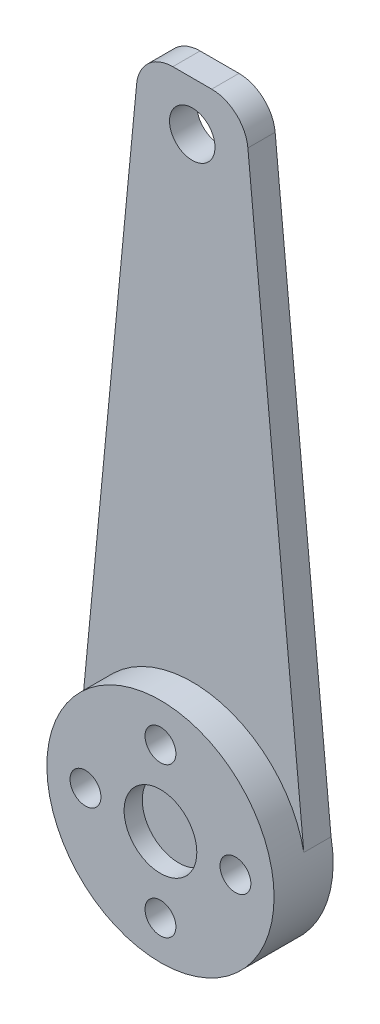
ISO-10303-21;
HEADER;
FILE_DESCRIPTION(('STEP AP214'),'2;1');
FILE_NAME('part.step','',(''),(''),'','','');
FILE_SCHEMA(('AUTOMOTIVE_DESIGN { 1 0 10303 214 1 1 1 1 }'));
ENDSEC;
DATA;
#1=APPLICATION_CONTEXT('core data for automotive mechanical design processes');
#2=APPLICATION_PROTOCOL_DEFINITION('international standard','automotive_design',2000,#1);
#3=PRODUCT_CONTEXT('',#1,'mechanical');
#4=PRODUCT('Part','Part','',(#3));
#5=PRODUCT_RELATED_PRODUCT_CATEGORY('part','',(#4));
#6=PRODUCT_DEFINITION_FORMATION('','',#4);
#7=PRODUCT_DEFINITION_CONTEXT('part definition',#1,'design');
#8=PRODUCT_DEFINITION('design','',#6,#7);
#9=PRODUCT_DEFINITION_SHAPE('','',#8);
#10=(LENGTH_UNIT() NAMED_UNIT(*) SI_UNIT(.MILLI.,.METRE.));
#11=(NAMED_UNIT(*) PLANE_ANGLE_UNIT() SI_UNIT($,.RADIAN.));
#12=(NAMED_UNIT(*) SI_UNIT($,.STERADIAN.) SOLID_ANGLE_UNIT());
#13=UNCERTAINTY_MEASURE_WITH_UNIT(LENGTH_MEASURE(1.E-05),#10,'distance_accuracy_value','');
#14=(GEOMETRIC_REPRESENTATION_CONTEXT(3) GLOBAL_UNCERTAINTY_ASSIGNED_CONTEXT((#13)) GLOBAL_UNIT_ASSIGNED_CONTEXT((#10,
#11,#12)) REPRESENTATION_CONTEXT('',''));
#15=CARTESIAN_POINT('',(0.,0.,0.));
#16=DIRECTION('',(0.,0.,1.));
#17=DIRECTION('',(1.,0.,0.));
#18=AXIS2_PLACEMENT_3D('',#15,#16,#17);
#19=CARTESIAN_POINT('',(0.,0.,3.25));
#20=DIRECTION('',(0.,0.,-1.));
#21=DIRECTION('',(-1.,0.,0.));
#22=AXIS2_PLACEMENT_3D('',#19,#20,#21);
#23=CYLINDRICAL_SURFACE('',#22,12.5);
#24=DIRECTION('',(0.,0.,-1.));
#25=VECTOR('',#24,1.);
#26=CARTESIAN_POINT('',(-12.2715228885609,2.3790178636418,3.25));
#27=LINE('',#26,#25);
#28=CARTESIAN_POINT('',(-12.2715228885609,2.37901786364178,-0.25));
#29=VERTEX_POINT('',#28);
#30=CARTESIAN_POINT('',(-12.2715228885609,2.37901786364177,-3.25));
#31=VERTEX_POINT('',#30);
#32=EDGE_CURVE('E102',#29,#31,#27,.T.);
#33=ORIENTED_EDGE('',*,*,#32,.T.);
#34=CARTESIAN_POINT('',(0.,0.,-3.25));
#35=DIRECTION('',(0.,0.,1.));
#36=DIRECTION('',(1.,0.,0.));
#37=AXIS2_PLACEMENT_3D('',#34,#35,#36);
#38=CIRCLE('',#37,12.5);
#39=CARTESIAN_POINT('',(12.2715228885609,2.37901786364172,-3.25));
#40=VERTEX_POINT('',#39);
#41=EDGE_CURVE('E89',#31,#40,#38,.T.);
#42=ORIENTED_EDGE('',*,*,#41,.T.);
#43=DIRECTION('',(0.,0.,-1.));
#44=VECTOR('',#43,1.);
#45=CARTESIAN_POINT('',(12.2715228885609,2.37901786364175,3.25));
#46=LINE('',#45,#44);
#47=CARTESIAN_POINT('',(12.2715228885609,2.37901786364178,-0.25));
#48=VERTEX_POINT('',#47);
#49=EDGE_CURVE('E99',#40,#48,#46,.F.);
#50=ORIENTED_EDGE('',*,*,#49,.T.);
#51=CARTESIAN_POINT('',(0.,0.,-0.25));
#52=DIRECTION('',(0.,0.,1.));
#53=DIRECTION('',(1.,0.,0.));
#54=AXIS2_PLACEMENT_3D('',#51,#52,#53);
#55=CIRCLE('',#54,12.5);
#56=EDGE_CURVE('E105',#48,#29,#55,.T.);
#57=ORIENTED_EDGE('',*,*,#56,.T.);
#58=EDGE_LOOP('',(#33,#42,#50,#57));
#59=FACE_BOUND('',#58,.T.);
#60=CARTESIAN_POINT('',(0.,0.,3.25));
#61=DIRECTION('',(0.,0.,1.));
#62=DIRECTION('',(1.,0.,0.));
#63=AXIS2_PLACEMENT_3D('',#60,#61,#62);
#64=CIRCLE('',#63,12.5);
#65=CARTESIAN_POINT('',(12.5,0.,3.25));
#66=VERTEX_POINT('',#65);
#67=EDGE_CURVE('E98',#66,#66,#64,.T.);
#68=ORIENTED_EDGE('',*,*,#67,.F.);
#69=EDGE_LOOP('',(#68));
#70=FACE_BOUND('',#69,.T.);
#71=ADVANCED_FACE('F35',(#59,#70),#23,.T.);
#72=CARTESIAN_POINT('',(0.,0.,3.25));
#73=DIRECTION('',(0.,0.,1.));
#74=DIRECTION('',(1.,0.,0.));
#75=AXIS2_PLACEMENT_3D('',#72,#73,#74);
#76=PLANE('',#75);
#77=CARTESIAN_POINT('',(0.,0.,3.25));
#78=DIRECTION('',(0.,0.,1.));
#79=DIRECTION('',(1.,0.,0.));
#80=AXIS2_PLACEMENT_3D('',#77,#78,#79);
#81=CIRCLE('',#80,4.);
#82=CARTESIAN_POINT('',(4.,0.,3.25));
#83=VERTEX_POINT('',#82);
#84=EDGE_CURVE('E178',#83,#83,#81,.T.);
#85=ORIENTED_EDGE('',*,*,#84,.F.);
#86=EDGE_LOOP('',(#85));
#87=FACE_BOUND('',#86,.T.);
#88=CARTESIAN_POINT('',(8.25,0.,3.25));
#89=DIRECTION('',(0.,0.,-1.));
#90=DIRECTION('',(-1.,0.,0.));
#91=AXIS2_PLACEMENT_3D('',#88,#89,#90);
#92=CIRCLE('',#91,1.7);
#93=CARTESIAN_POINT('',(6.55,0.,3.25));
#94=VERTEX_POINT('',#93);
#95=EDGE_CURVE('E136',#94,#94,#92,.T.);
#96=ORIENTED_EDGE('',*,*,#95,.T.);
#97=EDGE_LOOP('',(#96));
#98=FACE_BOUND('',#97,.T.);
#99=CARTESIAN_POINT('',(0.,8.25,3.25));
#100=DIRECTION('',(0.,0.,-1.));
#101=DIRECTION('',(-1.,0.,0.));
#102=AXIS2_PLACEMENT_3D('',#99,#100,#101);
#103=CIRCLE('',#102,1.7);
#104=CARTESIAN_POINT('',(-1.7,8.25,3.25));
#105=VERTEX_POINT('',#104);
#106=EDGE_CURVE('E173',#105,#105,#103,.T.);
#107=ORIENTED_EDGE('',*,*,#106,.T.);
#108=EDGE_LOOP('',(#107));
#109=FACE_BOUND('',#108,.T.);
#110=CARTESIAN_POINT('',(-8.25,0.,3.25));
#111=DIRECTION('',(0.,0.,-1.));
#112=DIRECTION('',(-1.,0.,0.));
#113=AXIS2_PLACEMENT_3D('',#110,#111,#112);
#114=CIRCLE('',#113,1.7);
#115=CARTESIAN_POINT('',(-9.95,0.,3.25));
#116=VERTEX_POINT('',#115);
#117=EDGE_CURVE('E169',#116,#116,#114,.T.);
#118=ORIENTED_EDGE('',*,*,#117,.T.);
#119=EDGE_LOOP('',(#118));
#120=FACE_BOUND('',#119,.T.);
#121=CARTESIAN_POINT('',(0.,-8.25,3.25));
#122=DIRECTION('',(0.,0.,-1.));
#123=DIRECTION('',(-1.,0.,0.));
#124=AXIS2_PLACEMENT_3D('',#121,#122,#123);
#125=CIRCLE('',#124,1.7);
#126=CARTESIAN_POINT('',(-1.7,-8.25,3.25));
#127=VERTEX_POINT('',#126);
#128=EDGE_CURVE('E166',#127,#127,#125,.T.);
#129=ORIENTED_EDGE('',*,*,#128,.T.);
#130=EDGE_LOOP('',(#129));
#131=FACE_BOUND('',#130,.T.);
#132=ORIENTED_EDGE('',*,*,#67,.T.);
#133=EDGE_LOOP('',(#132));
#134=FACE_BOUND('',#133,.T.);
#135=ADVANCED_FACE('F205',(#87,#98,#109,#120,#131,#134),#76,.T.);
#136=CARTESIAN_POINT('',(0.,0.,-3.25));
#137=DIRECTION('',(0.,0.,1.));
#138=DIRECTION('',(1.,0.,0.));
#139=AXIS2_PLACEMENT_3D('',#136,#137,#138);
#140=PLANE('',#139);
#141=CARTESIAN_POINT('',(0.,64.6965290631007,-3.25));
#142=DIRECTION('',(0.,0.,-1.));
#143=DIRECTION('',(-1.,0.,0.));
#144=AXIS2_PLACEMENT_3D('',#141,#142,#143);
#145=CIRCLE('',#144,2.5);
#146=CARTESIAN_POINT('',(-2.5,64.6965290631007,-3.25));
#147=VERTEX_POINT('',#146);
#148=EDGE_CURVE('E183',#147,#147,#145,.T.);
#149=ORIENTED_EDGE('',*,*,#148,.F.);
#150=EDGE_LOOP('',(#149));
#151=FACE_BOUND('',#150,.T.);
#152=CARTESIAN_POINT('',(8.25,0.,-3.25));
#153=DIRECTION('',(0.,0.,1.));
#154=DIRECTION('',(1.,0.,0.));
#155=AXIS2_PLACEMENT_3D('',#152,#153,#154);
#156=CIRCLE('',#155,1.7);
#157=CARTESIAN_POINT('',(6.55,0.,-3.25));
#158=VERTEX_POINT('',#157);
#159=EDGE_CURVE('E116',#158,#158,#156,.T.);
#160=ORIENTED_EDGE('',*,*,#159,.T.);
#161=EDGE_LOOP('',(#160));
#162=FACE_BOUND('',#161,.T.);
#163=CARTESIAN_POINT('',(0.,8.25,-3.25));
#164=DIRECTION('',(0.,0.,1.));
#165=DIRECTION('',(1.,0.,0.));
#166=AXIS2_PLACEMENT_3D('',#163,#164,#165);
#167=CIRCLE('',#166,1.7);
#168=CARTESIAN_POINT('',(-1.7,8.25,-3.25));
#169=VERTEX_POINT('',#168);
#170=EDGE_CURVE('E121',#169,#169,#167,.T.);
#171=ORIENTED_EDGE('',*,*,#170,.T.);
#172=EDGE_LOOP('',(#171));
#173=FACE_BOUND('',#172,.T.);
#174=CARTESIAN_POINT('',(-8.25,0.,-3.25));
#175=DIRECTION('',(0.,0.,1.));
#176=DIRECTION('',(1.,0.,0.));
#177=AXIS2_PLACEMENT_3D('',#174,#175,#176);
#178=CIRCLE('',#177,1.7);
#179=CARTESIAN_POINT('',(-9.95,0.,-3.25));
#180=VERTEX_POINT('',#179);
#181=EDGE_CURVE('E135',#180,#180,#178,.T.);
#182=ORIENTED_EDGE('',*,*,#181,.T.);
#183=EDGE_LOOP('',(#182));
#184=FACE_BOUND('',#183,.T.);
#185=CARTESIAN_POINT('',(0.,-8.25,-3.25));
#186=DIRECTION('',(0.,0.,1.));
#187=DIRECTION('',(1.,0.,0.));
#188=AXIS2_PLACEMENT_3D('',#185,#186,#187);
#189=CIRCLE('',#188,1.7);
#190=CARTESIAN_POINT('',(-1.7,-8.25,-3.25));
#191=VERTEX_POINT('',#190);
#192=EDGE_CURVE('E132',#191,#191,#189,.T.);
#193=ORIENTED_EDGE('',*,*,#192,.T.);
#194=EDGE_LOOP('',(#193));
#195=FACE_BOUND('',#194,.T.);
#196=DIRECTION('',(0.0955985588676156,0.995419969431212,0.));
#197=VECTOR('',#196,1.);
#198=CARTESIAN_POINT('',(-5.77219693795847,70.0532476397532,-3.25));
#199=LINE('',#198,#197);
#200=CARTESIAN_POINT('',(-6.11962607165147,66.4356418752236,-3.25));
#201=VERTEX_POINT('',#200);
#202=EDGE_CURVE('E93',#31,#201,#199,.T.);
#203=ORIENTED_EDGE('',*,*,#202,.T.);
#204=CARTESIAN_POINT('',(-2.13794619392663,66.0532476397532,-3.25));
#205=DIRECTION('',(0.,0.,1.));
#206=DIRECTION('',(1.,0.,0.));
#207=AXIS2_PLACEMENT_3D('',#204,#205,#206);
#208=CIRCLE('',#207,4.);
#209=CARTESIAN_POINT('',(-2.13794619392662,70.0532476397532,-3.25));
#210=VERTEX_POINT('',#209);
#211=EDGE_CURVE('E144',#201,#210,#208,.F.);
#212=ORIENTED_EDGE('',*,*,#211,.T.);
#213=DIRECTION('',(1.,0.,0.));
#214=VECTOR('',#213,1.);
#215=CARTESIAN_POINT('',(5.77219693795847,70.0532476397532,-3.25));
#216=LINE('',#215,#214);
#217=CARTESIAN_POINT('',(2.13794619392663,70.0532476397532,-3.25));
#218=VERTEX_POINT('',#217);
#219=EDGE_CURVE('E115',#210,#218,#216,.T.);
#220=ORIENTED_EDGE('',*,*,#219,.T.);
#221=CARTESIAN_POINT('',(2.13794619392663,66.0532476397532,-3.25));
#222=DIRECTION('',(0.,0.,1.));
#223=DIRECTION('',(1.,0.,0.));
#224=AXIS2_PLACEMENT_3D('',#221,#222,#223);
#225=CIRCLE('',#224,4.);
#226=CARTESIAN_POINT('',(6.11962607165148,66.4356418752236,-3.25));
#227=VERTEX_POINT('',#226);
#228=EDGE_CURVE('E142',#218,#227,#225,.F.);
#229=ORIENTED_EDGE('',*,*,#228,.T.);
#230=DIRECTION('',(0.0955985588676156,-0.995419969431212,0.));
#231=VECTOR('',#230,1.);
#232=CARTESIAN_POINT('',(12.5,0.,-3.25));
#233=LINE('',#232,#231);
#234=EDGE_CURVE('E94',#227,#40,#233,.T.);
#235=ORIENTED_EDGE('',*,*,#234,.T.);
#236=ORIENTED_EDGE('',*,*,#41,.F.);
#237=EDGE_LOOP('',(#203,#212,#220,#229,#235,#236));
#238=FACE_BOUND('',#237,.T.);
#239=ADVANCED_FACE('F91',(#151,#162,#173,#184,#195,#238),#140,.F.);
#240=CARTESIAN_POINT('',(12.5,0.,-0.25));
#241=DIRECTION('',(0.995419969431212,0.0955985588676156,0.));
#242=DIRECTION('',(-0.0955985588676156,0.995419969431212,0.));
#243=AXIS2_PLACEMENT_3D('',#240,#241,#242);
#244=PLANE('',#243);
#245=ORIENTED_EDGE('',*,*,#234,.F.);
#246=DIRECTION('',(0.,0.,-1.));
#247=VECTOR('',#246,1.);
#248=CARTESIAN_POINT('',(6.11962607165147,66.4356418752236,-0.25));
#249=LINE('',#248,#247);
#250=CARTESIAN_POINT('',(6.11962607165148,66.4356418752236,-0.25));
#251=VERTEX_POINT('',#250);
#252=EDGE_CURVE('E11',#227,#251,#249,.F.);
#253=ORIENTED_EDGE('',*,*,#252,.T.);
#254=DIRECTION('',(0.0955985588676156,-0.995419969431212,0.));
#255=VECTOR('',#254,1.);
#256=CARTESIAN_POINT('',(12.5,0.,-0.25));
#257=LINE('',#256,#255);
#258=EDGE_CURVE('E109',#251,#48,#257,.T.);
#259=ORIENTED_EDGE('',*,*,#258,.T.);
#260=ORIENTED_EDGE('',*,*,#49,.F.);
#261=EDGE_LOOP('',(#245,#253,#259,#260));
#262=FACE_BOUND('',#261,.T.);
#263=ADVANCED_FACE('F164',(#262),#244,.T.);
#264=CARTESIAN_POINT('',(-5.77219693795847,70.0532476397532,-0.25));
#265=DIRECTION('',(-0.995419969431212,0.0955985588676156,0.));
#266=DIRECTION('',(-0.0955985588676156,-0.995419969431212,0.));
#267=AXIS2_PLACEMENT_3D('',#264,#265,#266);
#268=PLANE('',#267);
#269=DIRECTION('',(0.0955985588676156,0.995419969431212,0.));
#270=VECTOR('',#269,1.);
#271=CARTESIAN_POINT('',(-5.77219693795847,70.0532476397532,-0.25));
#272=LINE('',#271,#270);
#273=CARTESIAN_POINT('',(-6.11962607165147,66.4356418752236,-0.25));
#274=VERTEX_POINT('',#273);
#275=EDGE_CURVE('E126',#29,#274,#272,.T.);
#276=ORIENTED_EDGE('',*,*,#275,.T.);
#277=DIRECTION('',(0.,0.,-1.));
#278=VECTOR('',#277,1.);
#279=CARTESIAN_POINT('',(-6.11962607165147,66.4356418752236,-0.25));
#280=LINE('',#279,#278);
#281=EDGE_CURVE('E114',#274,#201,#280,.T.);
#282=ORIENTED_EDGE('',*,*,#281,.T.);
#283=ORIENTED_EDGE('',*,*,#202,.F.);
#284=ORIENTED_EDGE('',*,*,#32,.F.);
#285=EDGE_LOOP('',(#276,#282,#283,#284));
#286=FACE_BOUND('',#285,.T.);
#287=ADVANCED_FACE('F112',(#286),#268,.T.);
#288=CARTESIAN_POINT('',(5.77219693795847,70.0532476397532,-0.25));
#289=DIRECTION('',(0.,1.,0.));
#290=DIRECTION('',(0.,0.,1.));
#291=AXIS2_PLACEMENT_3D('',#288,#289,#290);
#292=PLANE('',#291);
#293=ORIENTED_EDGE('',*,*,#219,.F.);
#294=DIRECTION('',(0.,0.,-1.));
#295=VECTOR('',#294,1.);
#296=CARTESIAN_POINT('',(-2.13794619392662,70.0532476397532,-0.25));
#297=LINE('',#296,#295);
#298=CARTESIAN_POINT('',(-2.13794619392662,70.0532476397532,-0.25));
#299=VERTEX_POINT('',#298);
#300=EDGE_CURVE('E149',#210,#299,#297,.F.);
#301=ORIENTED_EDGE('',*,*,#300,.T.);
#302=DIRECTION('',(1.,0.,0.));
#303=VECTOR('',#302,1.);
#304=CARTESIAN_POINT('',(5.77219693795847,70.0532476397532,-0.25));
#305=LINE('',#304,#303);
#306=CARTESIAN_POINT('',(2.13794619392663,70.0532476397532,-0.25));
#307=VERTEX_POINT('',#306);
#308=EDGE_CURVE('E154',#299,#307,#305,.T.);
#309=ORIENTED_EDGE('',*,*,#308,.T.);
#310=DIRECTION('',(0.,0.,-1.));
#311=VECTOR('',#310,1.);
#312=CARTESIAN_POINT('',(2.13794619392663,70.0532476397532,-0.25));
#313=LINE('',#312,#311);
#314=EDGE_CURVE('E146',#307,#218,#313,.T.);
#315=ORIENTED_EDGE('',*,*,#314,.T.);
#316=EDGE_LOOP('',(#293,#301,#309,#315));
#317=FACE_BOUND('',#316,.T.);
#318=ADVANCED_FACE('F161',(#317),#292,.T.);
#319=CARTESIAN_POINT('',(0.,0.,-0.25));
#320=DIRECTION('',(0.,0.,1.));
#321=DIRECTION('',(1.,0.,0.));
#322=AXIS2_PLACEMENT_3D('',#319,#320,#321);
#323=PLANE('',#322);
#324=CARTESIAN_POINT('',(0.,64.6965290631007,-0.25));
#325=DIRECTION('',(0.,0.,1.));
#326=DIRECTION('',(1.,0.,0.));
#327=AXIS2_PLACEMENT_3D('',#324,#325,#326);
#328=CIRCLE('',#327,2.5);
#329=CARTESIAN_POINT('',(-2.5,64.6965290631007,-0.25));
#330=VERTEX_POINT('',#329);
#331=EDGE_CURVE('E39',#330,#330,#328,.T.);
#332=ORIENTED_EDGE('',*,*,#331,.F.);
#333=EDGE_LOOP('',(#332));
#334=FACE_BOUND('',#333,.T.);
#335=ORIENTED_EDGE('',*,*,#308,.F.);
#336=CARTESIAN_POINT('',(-2.13794619392663,66.0532476397532,-0.25));
#337=DIRECTION('',(0.,0.,1.));
#338=DIRECTION('',(1.,0.,0.));
#339=AXIS2_PLACEMENT_3D('',#336,#337,#338);
#340=CIRCLE('',#339,4.);
#341=EDGE_CURVE('E44',#299,#274,#340,.T.);
#342=ORIENTED_EDGE('',*,*,#341,.T.);
#343=ORIENTED_EDGE('',*,*,#275,.F.);
#344=ORIENTED_EDGE('',*,*,#56,.F.);
#345=ORIENTED_EDGE('',*,*,#258,.F.);
#346=CARTESIAN_POINT('',(2.13794619392663,66.0532476397532,-0.25));
#347=DIRECTION('',(0.,0.,1.));
#348=DIRECTION('',(1.,0.,0.));
#349=AXIS2_PLACEMENT_3D('',#346,#347,#348);
#350=CIRCLE('',#349,4.);
#351=EDGE_CURVE('E56',#251,#307,#350,.T.);
#352=ORIENTED_EDGE('',*,*,#351,.T.);
#353=EDGE_LOOP('',(#335,#342,#343,#344,#345,#352));
#354=FACE_BOUND('',#353,.T.);
#355=ADVANCED_FACE('F153',(#334,#354),#323,.T.);
#356=CARTESIAN_POINT('',(0.,-8.25,3.25));
#357=DIRECTION('',(0.,0.,-1.));
#358=DIRECTION('',(-1.,0.,0.));
#359=AXIS2_PLACEMENT_3D('',#356,#357,#358);
#360=CYLINDRICAL_SURFACE('',#359,1.7);
#361=CARTESIAN_POINT('',(-1.7,-8.25,3.25));
#362=CARTESIAN_POINT('',(-1.7,-8.25,3.18229166666667));
#363=CARTESIAN_POINT('',(-1.7,-8.25,3.11458333333333));
#364=CARTESIAN_POINT('',(-1.7,-8.25,2.97916666666667));
#365=CARTESIAN_POINT('',(-1.7,-8.25,2.91145833333333));
#366=CARTESIAN_POINT('',(-1.7,-8.25,2.77604166666667));
#367=CARTESIAN_POINT('',(-1.7,-8.25,2.70833333333333));
#368=CARTESIAN_POINT('',(-1.7,-8.25,2.57291666666667));
#369=CARTESIAN_POINT('',(-1.7,-8.25,2.50520833333333));
#370=CARTESIAN_POINT('',(-1.7,-8.25,2.36979166666667));
#371=CARTESIAN_POINT('',(-1.7,-8.25,2.30208333333333));
#372=CARTESIAN_POINT('',(-1.7,-8.25,2.16666666666667));
#373=CARTESIAN_POINT('',(-1.7,-8.25,2.09895833333333));
#374=CARTESIAN_POINT('',(-1.7,-8.25,1.96354166666667));
#375=CARTESIAN_POINT('',(-1.7,-8.25,1.89583333333333));
#376=CARTESIAN_POINT('',(-1.7,-8.25,1.76041666666667));
#377=CARTESIAN_POINT('',(-1.7,-8.25,1.69270833333333));
#378=CARTESIAN_POINT('',(-1.7,-8.25,1.55729166666667));
#379=CARTESIAN_POINT('',(-1.7,-8.25,1.48958333333333));
#380=CARTESIAN_POINT('',(-1.7,-8.25,1.35416666666667));
#381=CARTESIAN_POINT('',(-1.7,-8.25,1.28645833333333));
#382=CARTESIAN_POINT('',(-1.7,-8.25,1.15104166666667));
#383=CARTESIAN_POINT('',(-1.7,-8.25,1.08333333333333));
#384=CARTESIAN_POINT('',(-1.7,-8.25,0.947916666666667));
#385=CARTESIAN_POINT('',(-1.7,-8.25,0.880208333333333));
#386=CARTESIAN_POINT('',(-1.7,-8.25,0.744791666666667));
#387=CARTESIAN_POINT('',(-1.7,-8.25,0.677083333333333));
#388=CARTESIAN_POINT('',(-1.7,-8.25,0.541666666666667));
#389=CARTESIAN_POINT('',(-1.7,-8.25,0.473958333333333));
#390=CARTESIAN_POINT('',(-1.7,-8.25,0.338541666666667));
#391=CARTESIAN_POINT('',(-1.7,-8.25,0.270833333333333));
#392=CARTESIAN_POINT('',(-1.7,-8.25,0.135416666666667));
#393=CARTESIAN_POINT('',(-1.7,-8.25,0.0677083333333334));
#394=CARTESIAN_POINT('',(-1.7,-8.25,-0.0677083333333334));
#395=CARTESIAN_POINT('',(-1.7,-8.25,-0.135416666666667));
#396=CARTESIAN_POINT('',(-1.7,-8.25,-0.270833333333333));
#397=CARTESIAN_POINT('',(-1.7,-8.25,-0.338541666666667));
#398=CARTESIAN_POINT('',(-1.7,-8.25,-0.473958333333333));
#399=CARTESIAN_POINT('',(-1.7,-8.25,-0.541666666666667));
#400=CARTESIAN_POINT('',(-1.7,-8.25,-0.677083333333333));
#401=CARTESIAN_POINT('',(-1.7,-8.25,-0.744791666666666));
#402=CARTESIAN_POINT('',(-1.7,-8.25,-0.880208333333333));
#403=CARTESIAN_POINT('',(-1.7,-8.25,-0.947916666666666));
#404=CARTESIAN_POINT('',(-1.7,-8.25,-1.08333333333333));
#405=CARTESIAN_POINT('',(-1.7,-8.25,-1.15104166666667));
#406=CARTESIAN_POINT('',(-1.7,-8.25,-1.28645833333333));
#407=CARTESIAN_POINT('',(-1.7,-8.25,-1.35416666666667));
#408=CARTESIAN_POINT('',(-1.7,-8.25,-1.48958333333333));
#409=CARTESIAN_POINT('',(-1.7,-8.25,-1.55729166666667));
#410=CARTESIAN_POINT('',(-1.7,-8.25,-1.69270833333333));
#411=CARTESIAN_POINT('',(-1.7,-8.25,-1.76041666666667));
#412=CARTESIAN_POINT('',(-1.7,-8.25,-1.89583333333333));
#413=CARTESIAN_POINT('',(-1.7,-8.25,-1.96354166666667));
#414=CARTESIAN_POINT('',(-1.7,-8.25,-2.09895833333333));
#415=CARTESIAN_POINT('',(-1.7,-8.25,-2.16666666666667));
#416=CARTESIAN_POINT('',(-1.7,-8.25,-2.30208333333333));
#417=CARTESIAN_POINT('',(-1.7,-8.25,-2.36979166666667));
#418=CARTESIAN_POINT('',(-1.7,-8.25,-2.50520833333333));
#419=CARTESIAN_POINT('',(-1.7,-8.25,-2.57291666666667));
#420=CARTESIAN_POINT('',(-1.7,-8.25,-2.70833333333333));
#421=CARTESIAN_POINT('',(-1.7,-8.25,-2.77604166666667));
#422=CARTESIAN_POINT('',(-1.7,-8.25,-2.91145833333333));
#423=CARTESIAN_POINT('',(-1.7,-8.25,-2.97916666666667));
#424=CARTESIAN_POINT('',(-1.7,-8.25,-3.11458333333333));
#425=CARTESIAN_POINT('',(-1.7,-8.25,-3.18229166666667));
#426=CARTESIAN_POINT('',(-1.7,-8.25,-3.25));
#427=B_SPLINE_CURVE_WITH_KNOTS('',3,(#361,#362,#363,#364,#365,#366,#367,#368,#369,#370,#371,
#372,#373,#374,#375,#376,#377,#378,#379,#380,#381,#382,#383,#384,#385,#386,#387,#388,#389,#390,
#391,#392,#393,#394,#395,#396,#397,#398,#399,#400,#401,#402,#403,#404,#405,#406,#407,#408,#409,
#410,#411,#412,#413,#414,#415,#416,#417,#418,#419,#420,#421,#422,#423,#424,#425,#426),
.UNSPECIFIED.,.F.,.F.,(4,2,2,2,2,2,2,2,2,2,2,2,2,2,2,2,2,2,2,2,2,2,2,2,2,2,2,2,2,2,2,2,4),(0.,
0.203125,0.40625,0.609375,0.8125,1.015625,1.21875,1.421875,1.625,1.828125,2.03125,2.234375,
2.4375,2.640625,2.84375,3.046875,3.25,3.453125,3.65625,3.859375,4.0625,4.265625,4.46875,
4.671875,4.875,5.078125,5.28125,5.484375,5.6875,5.890625,6.09375,6.296875,6.5),.UNSPECIFIED.);
#428=EDGE_CURVE('BSEAM193',#127,#191,#427,.T.);
#429=ORIENTED_EDGE('',*,*,#128,.F.);
#430=ORIENTED_EDGE('',*,*,#192,.F.);
#431=ORIENTED_EDGE('',*,*,#428,.T.);
#432=ORIENTED_EDGE('',*,*,#428,.F.);
#433=EDGE_LOOP('',(#429,#431,#430,#432));
#434=FACE_BOUND('',#433,.T.);
#435=ADVANCED_FACE('F193',(#434),#360,.F.);
#436=CARTESIAN_POINT('',(-8.25,0.,3.25));
#437=DIRECTION('',(0.,0.,-1.));
#438=DIRECTION('',(-1.,0.,0.));
#439=AXIS2_PLACEMENT_3D('',#436,#437,#438);
#440=CYLINDRICAL_SURFACE('',#439,1.7);
#441=CARTESIAN_POINT('',(-9.95,0.,3.25));
#442=CARTESIAN_POINT('',(-9.95,0.,3.18229166666667));
#443=CARTESIAN_POINT('',(-9.95,0.,3.11458333333333));
#444=CARTESIAN_POINT('',(-9.95,0.,2.97916666666667));
#445=CARTESIAN_POINT('',(-9.95,0.,2.91145833333333));
#446=CARTESIAN_POINT('',(-9.95,0.,2.77604166666667));
#447=CARTESIAN_POINT('',(-9.95,0.,2.70833333333333));
#448=CARTESIAN_POINT('',(-9.95,0.,2.57291666666667));
#449=CARTESIAN_POINT('',(-9.95,0.,2.50520833333333));
#450=CARTESIAN_POINT('',(-9.95,0.,2.36979166666667));
#451=CARTESIAN_POINT('',(-9.95,0.,2.30208333333333));
#452=CARTESIAN_POINT('',(-9.95,0.,2.16666666666667));
#453=CARTESIAN_POINT('',(-9.95,0.,2.09895833333333));
#454=CARTESIAN_POINT('',(-9.95,0.,1.96354166666667));
#455=CARTESIAN_POINT('',(-9.95,0.,1.89583333333333));
#456=CARTESIAN_POINT('',(-9.95,0.,1.76041666666667));
#457=CARTESIAN_POINT('',(-9.95,0.,1.69270833333333));
#458=CARTESIAN_POINT('',(-9.95,0.,1.55729166666667));
#459=CARTESIAN_POINT('',(-9.95,0.,1.48958333333333));
#460=CARTESIAN_POINT('',(-9.95,0.,1.35416666666667));
#461=CARTESIAN_POINT('',(-9.95,0.,1.28645833333333));
#462=CARTESIAN_POINT('',(-9.95,0.,1.15104166666667));
#463=CARTESIAN_POINT('',(-9.95,0.,1.08333333333333));
#464=CARTESIAN_POINT('',(-9.95,0.,0.947916666666667));
#465=CARTESIAN_POINT('',(-9.95,0.,0.880208333333333));
#466=CARTESIAN_POINT('',(-9.95,0.,0.744791666666667));
#467=CARTESIAN_POINT('',(-9.95,0.,0.677083333333333));
#468=CARTESIAN_POINT('',(-9.95,0.,0.541666666666667));
#469=CARTESIAN_POINT('',(-9.95,0.,0.473958333333333));
#470=CARTESIAN_POINT('',(-9.95,0.,0.338541666666667));
#471=CARTESIAN_POINT('',(-9.95,0.,0.270833333333333));
#472=CARTESIAN_POINT('',(-9.95,0.,0.135416666666667));
#473=CARTESIAN_POINT('',(-9.95,0.,0.0677083333333334));
#474=CARTESIAN_POINT('',(-9.95,0.,-0.0677083333333334));
#475=CARTESIAN_POINT('',(-9.95,0.,-0.135416666666667));
#476=CARTESIAN_POINT('',(-9.95,0.,-0.270833333333333));
#477=CARTESIAN_POINT('',(-9.95,0.,-0.338541666666667));
#478=CARTESIAN_POINT('',(-9.95,0.,-0.473958333333333));
#479=CARTESIAN_POINT('',(-9.95,0.,-0.541666666666667));
#480=CARTESIAN_POINT('',(-9.95,0.,-0.677083333333333));
#481=CARTESIAN_POINT('',(-9.95,0.,-0.744791666666666));
#482=CARTESIAN_POINT('',(-9.95,0.,-0.880208333333333));
#483=CARTESIAN_POINT('',(-9.95,0.,-0.947916666666666));
#484=CARTESIAN_POINT('',(-9.95,0.,-1.08333333333333));
#485=CARTESIAN_POINT('',(-9.95,0.,-1.15104166666667));
#486=CARTESIAN_POINT('',(-9.95,0.,-1.28645833333333));
#487=CARTESIAN_POINT('',(-9.95,0.,-1.35416666666667));
#488=CARTESIAN_POINT('',(-9.95,0.,-1.48958333333333));
#489=CARTESIAN_POINT('',(-9.95,0.,-1.55729166666667));
#490=CARTESIAN_POINT('',(-9.95,0.,-1.69270833333333));
#491=CARTESIAN_POINT('',(-9.95,0.,-1.76041666666667));
#492=CARTESIAN_POINT('',(-9.95,0.,-1.89583333333333));
#493=CARTESIAN_POINT('',(-9.95,0.,-1.96354166666667));
#494=CARTESIAN_POINT('',(-9.95,0.,-2.09895833333333));
#495=CARTESIAN_POINT('',(-9.95,0.,-2.16666666666667));
#496=CARTESIAN_POINT('',(-9.95,0.,-2.30208333333333));
#497=CARTESIAN_POINT('',(-9.95,0.,-2.36979166666667));
#498=CARTESIAN_POINT('',(-9.95,0.,-2.50520833333333));
#499=CARTESIAN_POINT('',(-9.95,0.,-2.57291666666667));
#500=CARTESIAN_POINT('',(-9.95,0.,-2.70833333333333));
#501=CARTESIAN_POINT('',(-9.95,0.,-2.77604166666667));
#502=CARTESIAN_POINT('',(-9.95,0.,-2.91145833333333));
#503=CARTESIAN_POINT('',(-9.95,0.,-2.97916666666667));
#504=CARTESIAN_POINT('',(-9.95,0.,-3.11458333333333));
#505=CARTESIAN_POINT('',(-9.95,0.,-3.18229166666667));
#506=CARTESIAN_POINT('',(-9.95,0.,-3.25));
#507=B_SPLINE_CURVE_WITH_KNOTS('',3,(#441,#442,#443,#444,#445,#446,#447,#448,#449,#450,#451,
#452,#453,#454,#455,#456,#457,#458,#459,#460,#461,#462,#463,#464,#465,#466,#467,#468,#469,#470,
#471,#472,#473,#474,#475,#476,#477,#478,#479,#480,#481,#482,#483,#484,#485,#486,#487,#488,#489,
#490,#491,#492,#493,#494,#495,#496,#497,#498,#499,#500,#501,#502,#503,#504,#505,#506),
.UNSPECIFIED.,.F.,.F.,(4,2,2,2,2,2,2,2,2,2,2,2,2,2,2,2,2,2,2,2,2,2,2,2,2,2,2,2,2,2,2,2,4),(0.,
0.203125,0.40625,0.609375,0.8125,1.015625,1.21875,1.421875,1.625,1.828125,2.03125,2.234375,
2.4375,2.640625,2.84375,3.046875,3.25,3.453125,3.65625,3.859375,4.0625,4.265625,4.46875,
4.671875,4.875,5.078125,5.28125,5.484375,5.6875,5.890625,6.09375,6.296875,6.5),.UNSPECIFIED.);
#508=EDGE_CURVE('BSEAM199',#116,#180,#507,.T.);
#509=ORIENTED_EDGE('',*,*,#117,.F.);
#510=ORIENTED_EDGE('',*,*,#181,.F.);
#511=ORIENTED_EDGE('',*,*,#508,.T.);
#512=ORIENTED_EDGE('',*,*,#508,.F.);
#513=EDGE_LOOP('',(#509,#511,#510,#512));
#514=FACE_BOUND('',#513,.T.);
#515=ADVANCED_FACE('F199',(#514),#440,.F.);
#516=CARTESIAN_POINT('',(0.,8.25,3.25));
#517=DIRECTION('',(0.,0.,-1.));
#518=DIRECTION('',(-1.,0.,0.));
#519=AXIS2_PLACEMENT_3D('',#516,#517,#518);
#520=CYLINDRICAL_SURFACE('',#519,1.7);
#521=CARTESIAN_POINT('',(-1.7,8.25,3.25));
#522=CARTESIAN_POINT('',(-1.7,8.25,3.18229166666667));
#523=CARTESIAN_POINT('',(-1.7,8.25,3.11458333333333));
#524=CARTESIAN_POINT('',(-1.7,8.25,2.97916666666667));
#525=CARTESIAN_POINT('',(-1.7,8.25,2.91145833333333));
#526=CARTESIAN_POINT('',(-1.7,8.25,2.77604166666667));
#527=CARTESIAN_POINT('',(-1.7,8.25,2.70833333333333));
#528=CARTESIAN_POINT('',(-1.7,8.25,2.57291666666667));
#529=CARTESIAN_POINT('',(-1.7,8.25,2.50520833333333));
#530=CARTESIAN_POINT('',(-1.7,8.25,2.36979166666667));
#531=CARTESIAN_POINT('',(-1.7,8.25,2.30208333333333));
#532=CARTESIAN_POINT('',(-1.7,8.25,2.16666666666667));
#533=CARTESIAN_POINT('',(-1.7,8.25,2.09895833333333));
#534=CARTESIAN_POINT('',(-1.7,8.25,1.96354166666667));
#535=CARTESIAN_POINT('',(-1.7,8.25,1.89583333333333));
#536=CARTESIAN_POINT('',(-1.7,8.25,1.76041666666667));
#537=CARTESIAN_POINT('',(-1.7,8.25,1.69270833333333));
#538=CARTESIAN_POINT('',(-1.7,8.25,1.55729166666667));
#539=CARTESIAN_POINT('',(-1.7,8.25,1.48958333333333));
#540=CARTESIAN_POINT('',(-1.7,8.25,1.35416666666667));
#541=CARTESIAN_POINT('',(-1.7,8.25,1.28645833333333));
#542=CARTESIAN_POINT('',(-1.7,8.25,1.15104166666667));
#543=CARTESIAN_POINT('',(-1.7,8.25,1.08333333333333));
#544=CARTESIAN_POINT('',(-1.7,8.25,0.947916666666667));
#545=CARTESIAN_POINT('',(-1.7,8.25,0.880208333333333));
#546=CARTESIAN_POINT('',(-1.7,8.25,0.744791666666667));
#547=CARTESIAN_POINT('',(-1.7,8.25,0.677083333333333));
#548=CARTESIAN_POINT('',(-1.7,8.25,0.541666666666667));
#549=CARTESIAN_POINT('',(-1.7,8.25,0.473958333333333));
#550=CARTESIAN_POINT('',(-1.7,8.25,0.338541666666667));
#551=CARTESIAN_POINT('',(-1.7,8.25,0.270833333333333));
#552=CARTESIAN_POINT('',(-1.7,8.25,0.135416666666667));
#553=CARTESIAN_POINT('',(-1.7,8.25,0.0677083333333334));
#554=CARTESIAN_POINT('',(-1.7,8.25,-0.0677083333333334));
#555=CARTESIAN_POINT('',(-1.7,8.25,-0.135416666666667));
#556=CARTESIAN_POINT('',(-1.7,8.25,-0.270833333333333));
#557=CARTESIAN_POINT('',(-1.7,8.25,-0.338541666666667));
#558=CARTESIAN_POINT('',(-1.7,8.25,-0.473958333333333));
#559=CARTESIAN_POINT('',(-1.7,8.25,-0.541666666666667));
#560=CARTESIAN_POINT('',(-1.7,8.25,-0.677083333333333));
#561=CARTESIAN_POINT('',(-1.7,8.25,-0.744791666666666));
#562=CARTESIAN_POINT('',(-1.7,8.25,-0.880208333333333));
#563=CARTESIAN_POINT('',(-1.7,8.25,-0.947916666666666));
#564=CARTESIAN_POINT('',(-1.7,8.25,-1.08333333333333));
#565=CARTESIAN_POINT('',(-1.7,8.25,-1.15104166666667));
#566=CARTESIAN_POINT('',(-1.7,8.25,-1.28645833333333));
#567=CARTESIAN_POINT('',(-1.7,8.25,-1.35416666666667));
#568=CARTESIAN_POINT('',(-1.7,8.25,-1.48958333333333));
#569=CARTESIAN_POINT('',(-1.7,8.25,-1.55729166666667));
#570=CARTESIAN_POINT('',(-1.7,8.25,-1.69270833333333));
#571=CARTESIAN_POINT('',(-1.7,8.25,-1.76041666666667));
#572=CARTESIAN_POINT('',(-1.7,8.25,-1.89583333333333));
#573=CARTESIAN_POINT('',(-1.7,8.25,-1.96354166666667));
#574=CARTESIAN_POINT('',(-1.7,8.25,-2.09895833333333));
#575=CARTESIAN_POINT('',(-1.7,8.25,-2.16666666666667));
#576=CARTESIAN_POINT('',(-1.7,8.25,-2.30208333333333));
#577=CARTESIAN_POINT('',(-1.7,8.25,-2.36979166666667));
#578=CARTESIAN_POINT('',(-1.7,8.25,-2.50520833333333));
#579=CARTESIAN_POINT('',(-1.7,8.25,-2.57291666666667));
#580=CARTESIAN_POINT('',(-1.7,8.25,-2.70833333333333));
#581=CARTESIAN_POINT('',(-1.7,8.25,-2.77604166666667));
#582=CARTESIAN_POINT('',(-1.7,8.25,-2.91145833333333));
#583=CARTESIAN_POINT('',(-1.7,8.25,-2.97916666666667));
#584=CARTESIAN_POINT('',(-1.7,8.25,-3.11458333333333));
#585=CARTESIAN_POINT('',(-1.7,8.25,-3.18229166666667));
#586=CARTESIAN_POINT('',(-1.7,8.25,-3.25));
#587=B_SPLINE_CURVE_WITH_KNOTS('',3,(#521,#522,#523,#524,#525,#526,#527,#528,#529,#530,#531,
#532,#533,#534,#535,#536,#537,#538,#539,#540,#541,#542,#543,#544,#545,#546,#547,#548,#549,#550,
#551,#552,#553,#554,#555,#556,#557,#558,#559,#560,#561,#562,#563,#564,#565,#566,#567,#568,#569,
#570,#571,#572,#573,#574,#575,#576,#577,#578,#579,#580,#581,#582,#583,#584,#585,#586),
.UNSPECIFIED.,.F.,.F.,(4,2,2,2,2,2,2,2,2,2,2,2,2,2,2,2,2,2,2,2,2,2,2,2,2,2,2,2,2,2,2,2,4),(0.,
0.203125,0.40625,0.609375,0.8125,1.015625,1.21875,1.421875,1.625,1.828125,2.03125,2.234375,
2.4375,2.640625,2.84375,3.046875,3.25,3.453125,3.65625,3.859375,4.0625,4.265625,4.46875,
4.671875,4.875,5.078125,5.28125,5.484375,5.6875,5.890625,6.09375,6.296875,6.5),.UNSPECIFIED.);
#588=EDGE_CURVE('BSEAM232',#105,#169,#587,.T.);
#589=ORIENTED_EDGE('',*,*,#106,.F.);
#590=ORIENTED_EDGE('',*,*,#170,.F.);
#591=ORIENTED_EDGE('',*,*,#588,.T.);
#592=ORIENTED_EDGE('',*,*,#588,.F.);
#593=EDGE_LOOP('',(#589,#591,#590,#592));
#594=FACE_BOUND('',#593,.T.);
#595=ADVANCED_FACE('F232',(#594),#520,.F.);
#596=CARTESIAN_POINT('',(8.25,0.,3.25));
#597=DIRECTION('',(0.,0.,-1.));
#598=DIRECTION('',(-1.,0.,0.));
#599=AXIS2_PLACEMENT_3D('',#596,#597,#598);
#600=CYLINDRICAL_SURFACE('',#599,1.7);
#601=CARTESIAN_POINT('',(6.55,0.,3.25));
#602=CARTESIAN_POINT('',(6.55,0.,3.18229166666667));
#603=CARTESIAN_POINT('',(6.55,0.,3.11458333333333));
#604=CARTESIAN_POINT('',(6.55,0.,2.97916666666667));
#605=CARTESIAN_POINT('',(6.55,0.,2.91145833333333));
#606=CARTESIAN_POINT('',(6.55,0.,2.77604166666667));
#607=CARTESIAN_POINT('',(6.55,0.,2.70833333333333));
#608=CARTESIAN_POINT('',(6.55,0.,2.57291666666667));
#609=CARTESIAN_POINT('',(6.55,0.,2.50520833333333));
#610=CARTESIAN_POINT('',(6.55,0.,2.36979166666667));
#611=CARTESIAN_POINT('',(6.55,0.,2.30208333333333));
#612=CARTESIAN_POINT('',(6.55,0.,2.16666666666667));
#613=CARTESIAN_POINT('',(6.55,0.,2.09895833333333));
#614=CARTESIAN_POINT('',(6.55,0.,1.96354166666667));
#615=CARTESIAN_POINT('',(6.55,0.,1.89583333333333));
#616=CARTESIAN_POINT('',(6.55,0.,1.76041666666667));
#617=CARTESIAN_POINT('',(6.55,0.,1.69270833333333));
#618=CARTESIAN_POINT('',(6.55,0.,1.55729166666667));
#619=CARTESIAN_POINT('',(6.55,0.,1.48958333333333));
#620=CARTESIAN_POINT('',(6.55,0.,1.35416666666667));
#621=CARTESIAN_POINT('',(6.55,0.,1.28645833333333));
#622=CARTESIAN_POINT('',(6.55,0.,1.15104166666667));
#623=CARTESIAN_POINT('',(6.55,0.,1.08333333333333));
#624=CARTESIAN_POINT('',(6.55,0.,0.947916666666667));
#625=CARTESIAN_POINT('',(6.55,0.,0.880208333333333));
#626=CARTESIAN_POINT('',(6.55,0.,0.744791666666667));
#627=CARTESIAN_POINT('',(6.55,0.,0.677083333333333));
#628=CARTESIAN_POINT('',(6.55,0.,0.541666666666667));
#629=CARTESIAN_POINT('',(6.55,0.,0.473958333333333));
#630=CARTESIAN_POINT('',(6.55,0.,0.338541666666667));
#631=CARTESIAN_POINT('',(6.55,0.,0.270833333333333));
#632=CARTESIAN_POINT('',(6.55,0.,0.135416666666667));
#633=CARTESIAN_POINT('',(6.55,0.,0.0677083333333334));
#634=CARTESIAN_POINT('',(6.55,0.,-0.0677083333333334));
#635=CARTESIAN_POINT('',(6.55,0.,-0.135416666666667));
#636=CARTESIAN_POINT('',(6.55,0.,-0.270833333333333));
#637=CARTESIAN_POINT('',(6.55,0.,-0.338541666666667));
#638=CARTESIAN_POINT('',(6.55,0.,-0.473958333333333));
#639=CARTESIAN_POINT('',(6.55,0.,-0.541666666666667));
#640=CARTESIAN_POINT('',(6.55,0.,-0.677083333333333));
#641=CARTESIAN_POINT('',(6.55,0.,-0.744791666666666));
#642=CARTESIAN_POINT('',(6.55,0.,-0.880208333333333));
#643=CARTESIAN_POINT('',(6.55,0.,-0.947916666666666));
#644=CARTESIAN_POINT('',(6.55,0.,-1.08333333333333));
#645=CARTESIAN_POINT('',(6.55,0.,-1.15104166666667));
#646=CARTESIAN_POINT('',(6.55,0.,-1.28645833333333));
#647=CARTESIAN_POINT('',(6.55,0.,-1.35416666666667));
#648=CARTESIAN_POINT('',(6.55,0.,-1.48958333333333));
#649=CARTESIAN_POINT('',(6.55,0.,-1.55729166666667));
#650=CARTESIAN_POINT('',(6.55,0.,-1.69270833333333));
#651=CARTESIAN_POINT('',(6.55,0.,-1.76041666666667));
#652=CARTESIAN_POINT('',(6.55,0.,-1.89583333333333));
#653=CARTESIAN_POINT('',(6.55,0.,-1.96354166666667));
#654=CARTESIAN_POINT('',(6.55,0.,-2.09895833333333));
#655=CARTESIAN_POINT('',(6.55,0.,-2.16666666666667));
#656=CARTESIAN_POINT('',(6.55,0.,-2.30208333333333));
#657=CARTESIAN_POINT('',(6.55,0.,-2.36979166666667));
#658=CARTESIAN_POINT('',(6.55,0.,-2.50520833333333));
#659=CARTESIAN_POINT('',(6.55,0.,-2.57291666666667));
#660=CARTESIAN_POINT('',(6.55,0.,-2.70833333333333));
#661=CARTESIAN_POINT('',(6.55,0.,-2.77604166666667));
#662=CARTESIAN_POINT('',(6.55,0.,-2.91145833333333));
#663=CARTESIAN_POINT('',(6.55,0.,-2.97916666666667));
#664=CARTESIAN_POINT('',(6.55,0.,-3.11458333333333));
#665=CARTESIAN_POINT('',(6.55,0.,-3.18229166666667));
#666=CARTESIAN_POINT('',(6.55,0.,-3.25));
#667=B_SPLINE_CURVE_WITH_KNOTS('',3,(#601,#602,#603,#604,#605,#606,#607,#608,#609,#610,#611,
#612,#613,#614,#615,#616,#617,#618,#619,#620,#621,#622,#623,#624,#625,#626,#627,#628,#629,#630,
#631,#632,#633,#634,#635,#636,#637,#638,#639,#640,#641,#642,#643,#644,#645,#646,#647,#648,#649,
#650,#651,#652,#653,#654,#655,#656,#657,#658,#659,#660,#661,#662,#663,#664,#665,#666),
.UNSPECIFIED.,.F.,.F.,(4,2,2,2,2,2,2,2,2,2,2,2,2,2,2,2,2,2,2,2,2,2,2,2,2,2,2,2,2,2,2,2,4),(0.,
0.203125,0.40625,0.609375,0.8125,1.015625,1.21875,1.421875,1.625,1.828125,2.03125,2.234375,
2.4375,2.640625,2.84375,3.046875,3.25,3.453125,3.65625,3.859375,4.0625,4.265625,4.46875,
4.671875,4.875,5.078125,5.28125,5.484375,5.6875,5.890625,6.09375,6.296875,6.5),.UNSPECIFIED.);
#668=EDGE_CURVE('BSEAM225',#94,#158,#667,.T.);
#669=ORIENTED_EDGE('',*,*,#95,.F.);
#670=ORIENTED_EDGE('',*,*,#159,.F.);
#671=ORIENTED_EDGE('',*,*,#668,.T.);
#672=ORIENTED_EDGE('',*,*,#668,.F.);
#673=EDGE_LOOP('',(#669,#671,#670,#672));
#674=FACE_BOUND('',#673,.T.);
#675=ADVANCED_FACE('F225',(#674),#600,.F.);
#676=CARTESIAN_POINT('',(0.,0.,1.25));
#677=DIRECTION('',(0.,0.,1.));
#678=DIRECTION('',(1.,0.,0.));
#679=AXIS2_PLACEMENT_3D('',#676,#677,#678);
#680=CYLINDRICAL_SURFACE('',#679,4.);
#681=CARTESIAN_POINT('',(0.,0.,1.25));
#682=DIRECTION('',(0.,0.,1.));
#683=DIRECTION('',(1.,0.,0.));
#684=AXIS2_PLACEMENT_3D('',#681,#682,#683);
#685=CIRCLE('',#684,4.);
#686=CARTESIAN_POINT('',(4.,0.,1.25));
#687=VERTEX_POINT('',#686);
#688=EDGE_CURVE('E170',#687,#687,#685,.T.);
#689=ORIENTED_EDGE('',*,*,#688,.F.);
#690=EDGE_LOOP('',(#689));
#691=FACE_BOUND('',#690,.T.);
#692=ORIENTED_EDGE('',*,*,#84,.T.);
#693=EDGE_LOOP('',(#692));
#694=FACE_BOUND('',#693,.T.);
#695=ADVANCED_FACE('F219',(#691,#694),#680,.F.);
#696=CARTESIAN_POINT('',(0.,0.,1.25));
#697=DIRECTION('',(0.,0.,1.));
#698=DIRECTION('',(1.,0.,0.));
#699=AXIS2_PLACEMENT_3D('',#696,#697,#698);
#700=PLANE('',#699);
#701=ORIENTED_EDGE('',*,*,#688,.T.);
#702=EDGE_LOOP('',(#701));
#703=FACE_BOUND('',#702,.T.);
#704=ADVANCED_FACE('F214',(#703),#700,.T.);
#705=CARTESIAN_POINT('',(-2.13794619392663,66.0532476397532,-0.25));
#706=DIRECTION('',(0.,0.,-1.));
#707=DIRECTION('',(-1.,0.,0.));
#708=AXIS2_PLACEMENT_3D('',#705,#706,#707);
#709=CYLINDRICAL_SURFACE('',#708,4.);
#710=ORIENTED_EDGE('',*,*,#341,.F.);
#711=ORIENTED_EDGE('',*,*,#300,.F.);
#712=ORIENTED_EDGE('',*,*,#211,.F.);
#713=ORIENTED_EDGE('',*,*,#281,.F.);
#714=EDGE_LOOP('',(#710,#711,#712,#713));
#715=FACE_BOUND('',#714,.T.);
#716=ADVANCED_FACE('F158',(#715),#709,.T.);
#717=CARTESIAN_POINT('',(2.13794619392663,66.0532476397532,-0.25));
#718=DIRECTION('',(0.,0.,-1.));
#719=DIRECTION('',(-1.,0.,0.));
#720=AXIS2_PLACEMENT_3D('',#717,#718,#719);
#721=CYLINDRICAL_SURFACE('',#720,4.);
#722=ORIENTED_EDGE('',*,*,#351,.F.);
#723=ORIENTED_EDGE('',*,*,#252,.F.);
#724=ORIENTED_EDGE('',*,*,#228,.F.);
#725=ORIENTED_EDGE('',*,*,#314,.F.);
#726=EDGE_LOOP('',(#722,#723,#724,#725));
#727=FACE_BOUND('',#726,.T.);
#728=ADVANCED_FACE('F37',(#727),#721,.T.);
#729=CARTESIAN_POINT('',(0.,64.6965290631007,3.25));
#730=DIRECTION('',(0.,0.,-1.));
#731=DIRECTION('',(-1.,0.,0.));
#732=AXIS2_PLACEMENT_3D('',#729,#730,#731);
#733=CYLINDRICAL_SURFACE('',#732,2.5);
#734=CARTESIAN_POINT('',(-2.5,64.6965290631007,-0.25));
#735=CARTESIAN_POINT('',(-2.5,64.6965290631007,-0.28125));
#736=CARTESIAN_POINT('',(-2.5,64.6965290631007,-0.3125));
#737=CARTESIAN_POINT('',(-2.5,64.6965290631007,-0.375));
#738=CARTESIAN_POINT('',(-2.5,64.6965290631007,-0.40625));
#739=CARTESIAN_POINT('',(-2.5,64.6965290631007,-0.46875));
#740=CARTESIAN_POINT('',(-2.5,64.6965290631007,-0.5));
#741=CARTESIAN_POINT('',(-2.5,64.6965290631007,-0.5625));
#742=CARTESIAN_POINT('',(-2.5,64.6965290631007,-0.59375));
#743=CARTESIAN_POINT('',(-2.5,64.6965290631007,-0.65625));
#744=CARTESIAN_POINT('',(-2.5,64.6965290631007,-0.6875));
#745=CARTESIAN_POINT('',(-2.5,64.6965290631007,-0.749999999999999));
#746=CARTESIAN_POINT('',(-2.5,64.6965290631007,-0.781249999999999));
#747=CARTESIAN_POINT('',(-2.5,64.6965290631007,-0.843749999999999));
#748=CARTESIAN_POINT('',(-2.5,64.6965290631007,-0.874999999999999));
#749=CARTESIAN_POINT('',(-2.5,64.6965290631007,-0.9375));
#750=CARTESIAN_POINT('',(-2.5,64.6965290631007,-0.96875));
#751=CARTESIAN_POINT('',(-2.5,64.6965290631007,-1.03125));
#752=CARTESIAN_POINT('',(-2.5,64.6965290631007,-1.0625));
#753=CARTESIAN_POINT('',(-2.5,64.6965290631007,-1.125));
#754=CARTESIAN_POINT('',(-2.5,64.6965290631007,-1.15625));
#755=CARTESIAN_POINT('',(-2.5,64.6965290631007,-1.21875));
#756=CARTESIAN_POINT('',(-2.5,64.6965290631007,-1.25));
#757=CARTESIAN_POINT('',(-2.5,64.6965290631007,-1.3125));
#758=CARTESIAN_POINT('',(-2.5,64.6965290631007,-1.34375));
#759=CARTESIAN_POINT('',(-2.5,64.6965290631007,-1.40625));
#760=CARTESIAN_POINT('',(-2.5,64.6965290631007,-1.4375));
#761=CARTESIAN_POINT('',(-2.5,64.6965290631007,-1.5));
#762=CARTESIAN_POINT('',(-2.5,64.6965290631007,-1.53125));
#763=CARTESIAN_POINT('',(-2.5,64.6965290631007,-1.59375));
#764=CARTESIAN_POINT('',(-2.5,64.6965290631007,-1.625));
#765=CARTESIAN_POINT('',(-2.5,64.6965290631007,-1.6875));
#766=CARTESIAN_POINT('',(-2.5,64.6965290631007,-1.71875));
#767=CARTESIAN_POINT('',(-2.5,64.6965290631007,-1.78125));
#768=CARTESIAN_POINT('',(-2.5,64.6965290631007,-1.8125));
#769=CARTESIAN_POINT('',(-2.5,64.6965290631007,-1.875));
#770=CARTESIAN_POINT('',(-2.5,64.6965290631007,-1.90625));
#771=CARTESIAN_POINT('',(-2.5,64.6965290631007,-1.96875));
#772=CARTESIAN_POINT('',(-2.5,64.6965290631007,-2.));
#773=CARTESIAN_POINT('',(-2.5,64.6965290631007,-2.0625));
#774=CARTESIAN_POINT('',(-2.5,64.6965290631007,-2.09375));
#775=CARTESIAN_POINT('',(-2.5,64.6965290631007,-2.15625));
#776=CARTESIAN_POINT('',(-2.5,64.6965290631007,-2.1875));
#777=CARTESIAN_POINT('',(-2.5,64.6965290631007,-2.25));
#778=CARTESIAN_POINT('',(-2.5,64.6965290631007,-2.28125));
#779=CARTESIAN_POINT('',(-2.5,64.6965290631007,-2.34375));
#780=CARTESIAN_POINT('',(-2.5,64.6965290631007,-2.375));
#781=CARTESIAN_POINT('',(-2.5,64.6965290631007,-2.4375));
#782=CARTESIAN_POINT('',(-2.5,64.6965290631007,-2.46875));
#783=CARTESIAN_POINT('',(-2.5,64.6965290631007,-2.53125));
#784=CARTESIAN_POINT('',(-2.5,64.6965290631007,-2.5625));
#785=CARTESIAN_POINT('',(-2.5,64.6965290631007,-2.625));
#786=CARTESIAN_POINT('',(-2.5,64.6965290631007,-2.65625));
#787=CARTESIAN_POINT('',(-2.5,64.6965290631007,-2.71875));
#788=CARTESIAN_POINT('',(-2.5,64.6965290631007,-2.75));
#789=CARTESIAN_POINT('',(-2.5,64.6965290631007,-2.8125));
#790=CARTESIAN_POINT('',(-2.5,64.6965290631007,-2.84375));
#791=CARTESIAN_POINT('',(-2.5,64.6965290631007,-2.90625));
#792=CARTESIAN_POINT('',(-2.5,64.6965290631007,-2.9375));
#793=CARTESIAN_POINT('',(-2.5,64.6965290631007,-3.));
#794=CARTESIAN_POINT('',(-2.5,64.6965290631007,-3.03125));
#795=CARTESIAN_POINT('',(-2.5,64.6965290631007,-3.09375));
#796=CARTESIAN_POINT('',(-2.5,64.6965290631007,-3.125));
#797=CARTESIAN_POINT('',(-2.5,64.6965290631007,-3.1875));
#798=CARTESIAN_POINT('',(-2.5,64.6965290631007,-3.21875));
#799=CARTESIAN_POINT('',(-2.5,64.6965290631007,-3.25));
#800=B_SPLINE_CURVE_WITH_KNOTS('',3,(#734,#735,#736,#737,#738,#739,#740,#741,#742,#743,#744,
#745,#746,#747,#748,#749,#750,#751,#752,#753,#754,#755,#756,#757,#758,#759,#760,#761,#762,#763,
#764,#765,#766,#767,#768,#769,#770,#771,#772,#773,#774,#775,#776,#777,#778,#779,#780,#781,#782,
#783,#784,#785,#786,#787,#788,#789,#790,#791,#792,#793,#794,#795,#796,#797,#798,#799),
.UNSPECIFIED.,.F.,.F.,(4,2,2,2,2,2,2,2,2,2,2,2,2,2,2,2,2,2,2,2,2,2,2,2,2,2,2,2,2,2,2,2,4),(0.,
0.0937500000000001,0.1875,0.28125,0.375,0.468749999999999,0.562499999999999,0.656249999999999,
0.749999999999999,0.843749999999999,0.9375,1.03125,1.125,1.21875,1.3125,1.40625,1.5,1.59375,
1.6875,1.78125,1.875,1.96875,2.0625,2.15625,2.25,2.34375,2.4375,2.53125,2.625,2.71875,2.8125,
2.90625,3.),.UNSPECIFIED.);
#801=EDGE_CURVE('BSEAM190',#330,#147,#800,.T.);
#802=ORIENTED_EDGE('',*,*,#331,.T.);
#803=ORIENTED_EDGE('',*,*,#148,.T.);
#804=ORIENTED_EDGE('',*,*,#801,.T.);
#805=ORIENTED_EDGE('',*,*,#801,.F.);
#806=EDGE_LOOP('',(#802,#804,#803,#805));
#807=FACE_BOUND('',#806,.T.);
#808=ADVANCED_FACE('F190',(#807),#733,.F.);
#809=CLOSED_SHELL('',(#71,#135,#239,#263,#287,#318,#355,#435,#515,#595,#675,#695,#704,#716,#728,#808));
#810=MANIFOLD_SOLID_BREP('B2',#809);
#811=ADVANCED_BREP_SHAPE_REPRESENTATION('',(#18,#810),#14);
#812=SHAPE_DEFINITION_REPRESENTATION(#9,#811);
ENDSEC;
END-ISO-10303-21;
